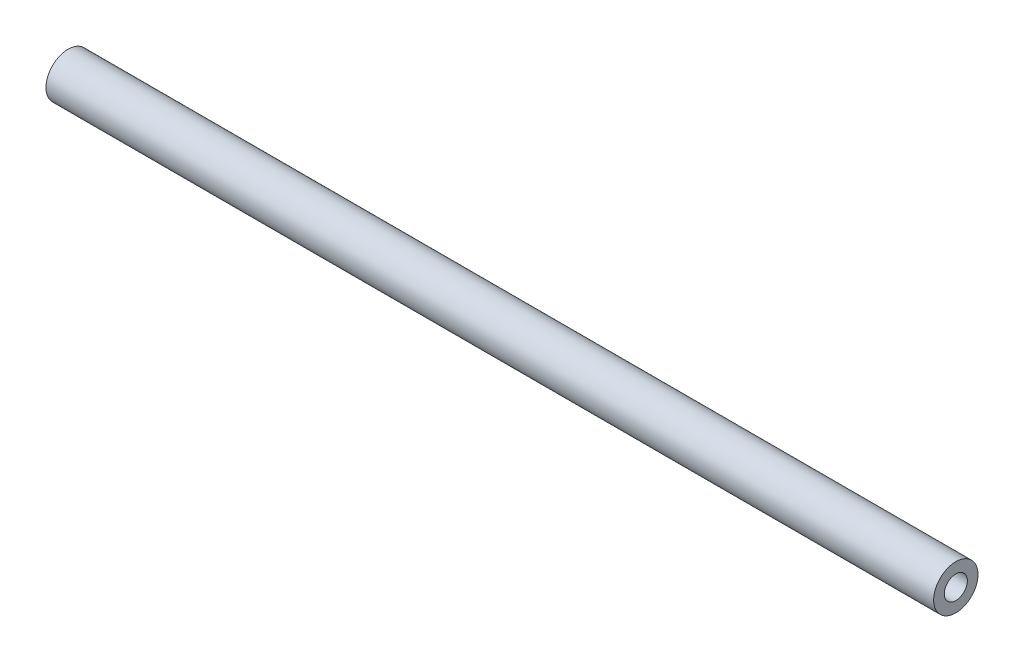
ISO-10303-21;
HEADER;
FILE_DESCRIPTION(('STEP AP214'),'2;1');
FILE_NAME('part.step','',(''),(''),'','','');
FILE_SCHEMA(('AUTOMOTIVE_DESIGN { 1 0 10303 214 1 1 1 1 }'));
ENDSEC;
DATA;
#1=APPLICATION_CONTEXT('core data for automotive mechanical design processes');
#2=APPLICATION_PROTOCOL_DEFINITION('international standard','automotive_design',2000,#1);
#3=PRODUCT_CONTEXT('',#1,'mechanical');
#4=PRODUCT('Part','Part','',(#3));
#5=PRODUCT_RELATED_PRODUCT_CATEGORY('part','',(#4));
#6=PRODUCT_DEFINITION_FORMATION('','',#4);
#7=PRODUCT_DEFINITION_CONTEXT('part definition',#1,'design');
#8=PRODUCT_DEFINITION('design','',#6,#7);
#9=PRODUCT_DEFINITION_SHAPE('','',#8);
#10=(LENGTH_UNIT() NAMED_UNIT(*) SI_UNIT(.MILLI.,.METRE.));
#11=(NAMED_UNIT(*) PLANE_ANGLE_UNIT() SI_UNIT($,.RADIAN.));
#12=(NAMED_UNIT(*) SI_UNIT($,.STERADIAN.) SOLID_ANGLE_UNIT());
#13=UNCERTAINTY_MEASURE_WITH_UNIT(LENGTH_MEASURE(1.E-05),#10,'distance_accuracy_value','');
#14=(GEOMETRIC_REPRESENTATION_CONTEXT(3) GLOBAL_UNCERTAINTY_ASSIGNED_CONTEXT((#13)) GLOBAL_UNIT_ASSIGNED_CONTEXT((#10,
#11,#12)) REPRESENTATION_CONTEXT('',''));
#15=CARTESIAN_POINT('',(0.,0.,0.));
#16=DIRECTION('',(0.,0.,1.));
#17=DIRECTION('',(1.,0.,0.));
#18=AXIS2_PLACEMENT_3D('',#15,#16,#17);
#19=CARTESIAN_POINT('',(127.,0.,0.));
#20=DIRECTION('',(1.,0.,0.));
#21=DIRECTION('',(0.,0.,-1.));
#22=AXIS2_PLACEMENT_3D('',#19,#20,#21);
#23=PLANE('',#22);
#24=CARTESIAN_POINT('',(127.,0.,0.));
#25=DIRECTION('',(1.,0.,0.));
#26=DIRECTION('',(0.,0.,-1.));
#27=AXIS2_PLACEMENT_3D('',#24,#25,#26);
#28=CIRCLE('',#27,6.35);
#29=CARTESIAN_POINT('',(127.,0.,-6.35));
#30=VERTEX_POINT('',#29);
#31=EDGE_CURVE('E10',#30,#30,#28,.T.);
#32=ORIENTED_EDGE('',*,*,#31,.T.);
#33=EDGE_LOOP('',(#32));
#34=FACE_BOUND('',#33,.T.);
#35=CARTESIAN_POINT('',(127.,0.,0.));
#36=DIRECTION('',(1.,0.,0.));
#37=DIRECTION('',(0.,0.,-1.));
#38=AXIS2_PLACEMENT_3D('',#35,#36,#37);
#39=CIRCLE('',#38,3.302);
#40=CARTESIAN_POINT('',(127.,0.,-3.302));
#41=VERTEX_POINT('',#40);
#42=EDGE_CURVE('E52',#41,#41,#39,.T.);
#43=ORIENTED_EDGE('',*,*,#42,.F.);
#44=EDGE_LOOP('',(#43));
#45=FACE_BOUND('',#44,.T.);
#46=ADVANCED_FACE('F39',(#34,#45),#23,.T.);
#47=CARTESIAN_POINT('',(-127.,0.,0.));
#48=DIRECTION('',(1.,0.,0.));
#49=DIRECTION('',(0.,0.,-1.));
#50=AXIS2_PLACEMENT_3D('',#47,#48,#49);
#51=PLANE('',#50);
#52=CARTESIAN_POINT('',(-127.,0.,0.));
#53=DIRECTION('',(1.,0.,0.));
#54=DIRECTION('',(0.,0.,-1.));
#55=AXIS2_PLACEMENT_3D('',#52,#53,#54);
#56=CIRCLE('',#55,6.35);
#57=CARTESIAN_POINT('',(-127.,0.,-6.35));
#58=VERTEX_POINT('',#57);
#59=EDGE_CURVE('E43',#58,#58,#56,.T.);
#60=ORIENTED_EDGE('',*,*,#59,.F.);
#61=EDGE_LOOP('',(#60));
#62=FACE_BOUND('',#61,.T.);
#63=CARTESIAN_POINT('',(-127.,0.,0.));
#64=DIRECTION('',(1.,0.,0.));
#65=DIRECTION('',(0.,0.,-1.));
#66=AXIS2_PLACEMENT_3D('',#63,#64,#65);
#67=CIRCLE('',#66,3.302);
#68=CARTESIAN_POINT('',(-127.,0.,-3.302));
#69=VERTEX_POINT('',#68);
#70=EDGE_CURVE('E54',#69,#69,#67,.T.);
#71=ORIENTED_EDGE('',*,*,#70,.T.);
#72=EDGE_LOOP('',(#71));
#73=FACE_BOUND('',#72,.T.);
#74=ADVANCED_FACE('F66',(#62,#73),#51,.F.);
#75=CARTESIAN_POINT('',(127.,0.,0.));
#76=DIRECTION('',(-1.,0.,0.));
#77=DIRECTION('',(0.,0.,1.));
#78=AXIS2_PLACEMENT_3D('',#75,#76,#77);
#79=CYLINDRICAL_SURFACE('',#78,6.35);
#80=ORIENTED_EDGE('',*,*,#31,.F.);
#81=EDGE_LOOP('',(#80));
#82=FACE_BOUND('',#81,.T.);
#83=ORIENTED_EDGE('',*,*,#59,.T.);
#84=EDGE_LOOP('',(#83));
#85=FACE_BOUND('',#84,.T.);
#86=ADVANCED_FACE('F41',(#82,#85),#79,.T.);
#87=CARTESIAN_POINT('',(127.,0.,0.));
#88=DIRECTION('',(-1.,0.,0.));
#89=DIRECTION('',(0.,0.,1.));
#90=AXIS2_PLACEMENT_3D('',#87,#88,#89);
#91=CYLINDRICAL_SURFACE('',#90,3.302);
#92=ORIENTED_EDGE('',*,*,#42,.T.);
#93=EDGE_LOOP('',(#92));
#94=FACE_BOUND('',#93,.T.);
#95=ORIENTED_EDGE('',*,*,#70,.F.);
#96=EDGE_LOOP('',(#95));
#97=FACE_BOUND('',#96,.T.);
#98=ADVANCED_FACE('F62',(#94,#97),#91,.F.);
#99=CLOSED_SHELL('',(#46,#74,#86,#98));
#100=MANIFOLD_SOLID_BREP('B2',#99);
#101=ADVANCED_BREP_SHAPE_REPRESENTATION('',(#18,#100),#14);
#102=SHAPE_DEFINITION_REPRESENTATION(#9,#101);
ENDSEC;
END-ISO-10303-21;
